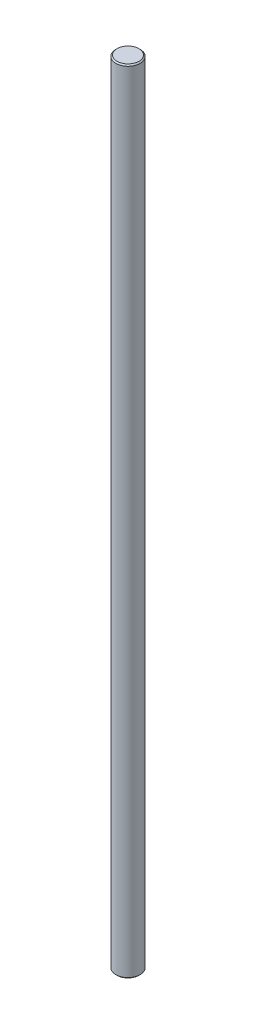
ISO-10303-21;
HEADER;
FILE_DESCRIPTION(('STEP AP214'),'2;1');
FILE_NAME('part.step','',(''),(''),'','','');
FILE_SCHEMA(('AUTOMOTIVE_DESIGN { 1 0 10303 214 1 1 1 1 }'));
ENDSEC;
DATA;
#1=APPLICATION_CONTEXT('core data for automotive mechanical design processes');
#2=APPLICATION_PROTOCOL_DEFINITION('international standard','automotive_design',2000,#1);
#3=PRODUCT_CONTEXT('',#1,'mechanical');
#4=PRODUCT('Part','Part','',(#3));
#5=PRODUCT_RELATED_PRODUCT_CATEGORY('part','',(#4));
#6=PRODUCT_DEFINITION_FORMATION('','',#4);
#7=PRODUCT_DEFINITION_CONTEXT('part definition',#1,'design');
#8=PRODUCT_DEFINITION('design','',#6,#7);
#9=PRODUCT_DEFINITION_SHAPE('','',#8);
#10=(LENGTH_UNIT() NAMED_UNIT(*) SI_UNIT(.MILLI.,.METRE.));
#11=(NAMED_UNIT(*) PLANE_ANGLE_UNIT() SI_UNIT($,.RADIAN.));
#12=(NAMED_UNIT(*) SI_UNIT($,.STERADIAN.) SOLID_ANGLE_UNIT());
#13=UNCERTAINTY_MEASURE_WITH_UNIT(LENGTH_MEASURE(1.E-05),#10,'distance_accuracy_value','');
#14=(GEOMETRIC_REPRESENTATION_CONTEXT(3) GLOBAL_UNCERTAINTY_ASSIGNED_CONTEXT((#13)) GLOBAL_UNIT_ASSIGNED_CONTEXT((#10,
#11,#12)) REPRESENTATION_CONTEXT('',''));
#15=CARTESIAN_POINT('',(0.,0.,0.));
#16=DIRECTION('',(0.,0.,1.));
#17=DIRECTION('',(1.,0.,0.));
#18=AXIS2_PLACEMENT_3D('',#15,#16,#17);
#19=CARTESIAN_POINT('',(0.,650.,0.));
#20=DIRECTION('',(0.,-1.,0.));
#21=DIRECTION('',(0.,0.,-1.));
#22=AXIS2_PLACEMENT_3D('',#19,#20,#21);
#23=CYLINDRICAL_SURFACE('',#22,10.);
#24=CARTESIAN_POINT('',(0.,649.,0.));
#25=DIRECTION('',(0.,1.,0.));
#26=DIRECTION('',(0.,0.,1.));
#27=AXIS2_PLACEMENT_3D('',#24,#25,#26);
#28=CIRCLE('',#27,10.);
#29=CARTESIAN_POINT('',(0.,649.,10.));
#30=VERTEX_POINT('',#29);
#31=EDGE_CURVE('E38',#30,#30,#28,.F.);
#32=ORIENTED_EDGE('',*,*,#31,.T.);
#33=EDGE_LOOP('',(#32));
#34=FACE_BOUND('',#33,.T.);
#35=CARTESIAN_POINT('',(0.,1.00000000000022,0.));
#36=DIRECTION('',(0.,1.,0.));
#37=DIRECTION('',(0.,0.,1.));
#38=AXIS2_PLACEMENT_3D('',#35,#36,#37);
#39=CIRCLE('',#38,10.);
#40=CARTESIAN_POINT('',(0.,1.00000000000022,10.));
#41=VERTEX_POINT('',#40);
#42=EDGE_CURVE('E42',#41,#41,#39,.T.);
#43=ORIENTED_EDGE('',*,*,#42,.T.);
#44=EDGE_LOOP('',(#43));
#45=FACE_BOUND('',#44,.T.);
#46=ADVANCED_FACE('F31',(#34,#45),#23,.T.);
#47=CARTESIAN_POINT('',(0.,650.,0.));
#48=DIRECTION('',(0.,1.,0.));
#49=DIRECTION('',(0.,0.,1.));
#50=AXIS2_PLACEMENT_3D('',#47,#48,#49);
#51=PLANE('',#50);
#52=CARTESIAN_POINT('',(0.,650.,0.));
#53=DIRECTION('',(0.,1.,0.));
#54=DIRECTION('',(0.,0.,1.));
#55=AXIS2_PLACEMENT_3D('',#52,#53,#54);
#56=CIRCLE('',#55,9.00000000000006);
#57=CARTESIAN_POINT('',(0.,650.,9.00000000000006));
#58=VERTEX_POINT('',#57);
#59=EDGE_CURVE('E46',#58,#58,#56,.T.);
#60=ORIENTED_EDGE('',*,*,#59,.T.);
#61=EDGE_LOOP('',(#60));
#62=FACE_BOUND('',#61,.T.);
#63=ADVANCED_FACE('F52',(#62),#51,.T.);
#64=CARTESIAN_POINT('',(0.,0.,0.));
#65=DIRECTION('',(0.,1.,0.));
#66=DIRECTION('',(0.,0.,1.));
#67=AXIS2_PLACEMENT_3D('',#64,#65,#66);
#68=PLANE('',#67);
#69=CARTESIAN_POINT('',(0.,0.,0.));
#70=DIRECTION('',(0.,1.,0.));
#71=DIRECTION('',(0.,0.,1.));
#72=AXIS2_PLACEMENT_3D('',#69,#70,#71);
#73=CIRCLE('',#72,8.99999999999979);
#74=CARTESIAN_POINT('',(0.,0.,8.99999999999979));
#75=VERTEX_POINT('',#74);
#76=EDGE_CURVE('E10',#75,#75,#73,.F.);
#77=ORIENTED_EDGE('',*,*,#76,.T.);
#78=EDGE_LOOP('',(#77));
#79=FACE_BOUND('',#78,.T.);
#80=ADVANCED_FACE('F56',(#79),#68,.F.);
#81=CARTESIAN_POINT('',(0.,650.,0.));
#82=DIRECTION('',(0.,-1.,0.));
#83=DIRECTION('',(0.,0.,-1.));
#84=AXIS2_PLACEMENT_3D('',#81,#82,#83);
#85=CONICAL_SURFACE('',#84,9.00000000000006,0.785398163397416);
#86=ORIENTED_EDGE('',*,*,#31,.F.);
#87=EDGE_LOOP('',(#86));
#88=FACE_BOUND('',#87,.T.);
#89=ORIENTED_EDGE('',*,*,#59,.F.);
#90=EDGE_LOOP('',(#89));
#91=FACE_BOUND('',#90,.T.);
#92=ADVANCED_FACE('F54',(#88,#91),#85,.T.);
#93=CARTESIAN_POINT('',(0.,1.00000000000022,0.));
#94=DIRECTION('',(0.,1.,0.));
#95=DIRECTION('',(0.,0.,1.));
#96=AXIS2_PLACEMENT_3D('',#93,#94,#95);
#97=CONICAL_SURFACE('',#96,10.,0.785398163397444);
#98=ORIENTED_EDGE('',*,*,#76,.F.);
#99=EDGE_LOOP('',(#98));
#100=FACE_BOUND('',#99,.T.);
#101=ORIENTED_EDGE('',*,*,#42,.F.);
#102=EDGE_LOOP('',(#101));
#103=FACE_BOUND('',#102,.T.);
#104=ADVANCED_FACE('F33',(#100,#103),#97,.T.);
#105=CLOSED_SHELL('',(#46,#63,#80,#92,#104));
#106=MANIFOLD_SOLID_BREP('B2',#105);
#107=ADVANCED_BREP_SHAPE_REPRESENTATION('',(#18,#106),#14);
#108=SHAPE_DEFINITION_REPRESENTATION(#9,#107);
ENDSEC;
END-ISO-10303-21;
